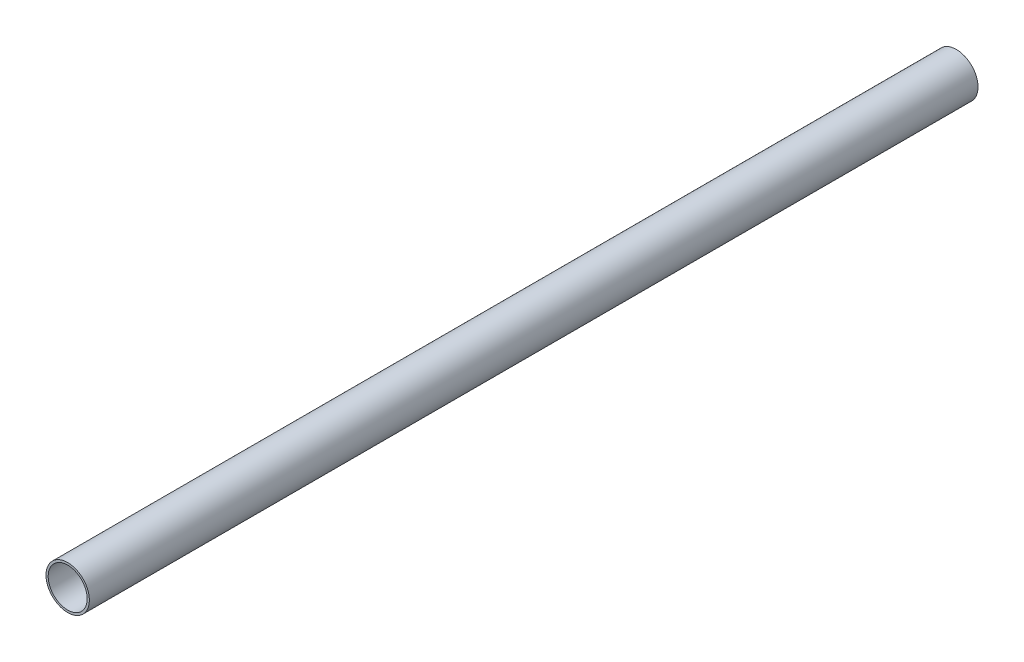
ISO-10303-21;
HEADER;
FILE_DESCRIPTION(('STEP AP214'),'2;1');
FILE_NAME('part.step','',(''),(''),'','','');
FILE_SCHEMA(('AUTOMOTIVE_DESIGN { 1 0 10303 214 1 1 1 1 }'));
ENDSEC;
DATA;
#1=APPLICATION_CONTEXT('core data for automotive mechanical design processes');
#2=APPLICATION_PROTOCOL_DEFINITION('international standard','automotive_design',2000,#1);
#3=PRODUCT_CONTEXT('',#1,'mechanical');
#4=PRODUCT('Part','Part','',(#3));
#5=PRODUCT_RELATED_PRODUCT_CATEGORY('part','',(#4));
#6=PRODUCT_DEFINITION_FORMATION('','',#4);
#7=PRODUCT_DEFINITION_CONTEXT('part definition',#1,'design');
#8=PRODUCT_DEFINITION('design','',#6,#7);
#9=PRODUCT_DEFINITION_SHAPE('','',#8);
#10=(LENGTH_UNIT() NAMED_UNIT(*) SI_UNIT(.MILLI.,.METRE.));
#11=(NAMED_UNIT(*) PLANE_ANGLE_UNIT() SI_UNIT($,.RADIAN.));
#12=(NAMED_UNIT(*) SI_UNIT($,.STERADIAN.) SOLID_ANGLE_UNIT());
#13=UNCERTAINTY_MEASURE_WITH_UNIT(LENGTH_MEASURE(1.E-05),#10,'distance_accuracy_value','');
#14=(GEOMETRIC_REPRESENTATION_CONTEXT(3) GLOBAL_UNCERTAINTY_ASSIGNED_CONTEXT((#13)) GLOBAL_UNIT_ASSIGNED_CONTEXT((#10,
#11,#12)) REPRESENTATION_CONTEXT('',''));
#15=CARTESIAN_POINT('',(0.,0.,0.));
#16=DIRECTION('',(0.,0.,1.));
#17=DIRECTION('',(1.,0.,0.));
#18=AXIS2_PLACEMENT_3D('',#15,#16,#17);
#19=CARTESIAN_POINT('',(0.,0.,410.));
#20=DIRECTION('',(0.,0.,1.));
#21=DIRECTION('',(1.,0.,0.));
#22=AXIS2_PLACEMENT_3D('',#19,#20,#21);
#23=PLANE('',#22);
#24=CARTESIAN_POINT('',(0.,0.,410.));
#25=DIRECTION('',(0.,0.,1.));
#26=DIRECTION('',(1.,0.,0.));
#27=AXIS2_PLACEMENT_3D('',#24,#25,#26);
#28=CIRCLE('',#27,10.);
#29=CARTESIAN_POINT('',(-10.,0.,410.));
#30=VERTEX_POINT('',#29);
#31=EDGE_CURVE('E10',#30,#30,#28,.T.);
#32=ORIENTED_EDGE('',*,*,#31,.T.);
#33=EDGE_LOOP('',(#32));
#34=FACE_BOUND('',#33,.T.);
#35=CARTESIAN_POINT('',(0.,0.,410.));
#36=DIRECTION('',(0.,0.,1.));
#37=DIRECTION('',(1.,0.,0.));
#38=AXIS2_PLACEMENT_3D('',#35,#36,#37);
#39=CIRCLE('',#38,9.);
#40=CARTESIAN_POINT('',(-9.,0.,410.));
#41=VERTEX_POINT('',#40);
#42=EDGE_CURVE('E54',#41,#41,#39,.T.);
#43=ORIENTED_EDGE('',*,*,#42,.F.);
#44=EDGE_LOOP('',(#43));
#45=FACE_BOUND('',#44,.T.);
#46=ADVANCED_FACE('F41',(#34,#45),#23,.T.);
#47=CARTESIAN_POINT('',(0.,0.,0.));
#48=DIRECTION('',(0.,0.,1.));
#49=DIRECTION('',(1.,0.,0.));
#50=AXIS2_PLACEMENT_3D('',#47,#48,#49);
#51=PLANE('',#50);
#52=CARTESIAN_POINT('',(0.,0.,0.));
#53=DIRECTION('',(0.,0.,1.));
#54=DIRECTION('',(1.,0.,0.));
#55=AXIS2_PLACEMENT_3D('',#52,#53,#54);
#56=CIRCLE('',#55,10.);
#57=CARTESIAN_POINT('',(-10.,0.,0.));
#58=VERTEX_POINT('',#57);
#59=EDGE_CURVE('E45',#58,#58,#56,.T.);
#60=ORIENTED_EDGE('',*,*,#59,.F.);
#61=EDGE_LOOP('',(#60));
#62=FACE_BOUND('',#61,.T.);
#63=CARTESIAN_POINT('',(0.,0.,0.));
#64=DIRECTION('',(0.,0.,1.));
#65=DIRECTION('',(1.,0.,0.));
#66=AXIS2_PLACEMENT_3D('',#63,#64,#65);
#67=CIRCLE('',#66,9.);
#68=CARTESIAN_POINT('',(-9.,0.,0.));
#69=VERTEX_POINT('',#68);
#70=EDGE_CURVE('E56',#69,#69,#67,.T.);
#71=ORIENTED_EDGE('',*,*,#70,.T.);
#72=EDGE_LOOP('',(#71));
#73=FACE_BOUND('',#72,.T.);
#74=ADVANCED_FACE('F68',(#62,#73),#51,.F.);
#75=CARTESIAN_POINT('',(0.,0.,410.));
#76=DIRECTION('',(0.,0.,-1.));
#77=DIRECTION('',(-1.,0.,0.));
#78=AXIS2_PLACEMENT_3D('',#75,#76,#77);
#79=CYLINDRICAL_SURFACE('',#78,10.);
#80=CARTESIAN_POINT('',(-10.,0.,410.));
#81=CARTESIAN_POINT('',(-10.,0.,405.729166666667));
#82=CARTESIAN_POINT('',(-10.,0.,401.458333333333));
#83=CARTESIAN_POINT('',(-10.,0.,392.916666666667));
#84=CARTESIAN_POINT('',(-10.,0.,388.645833333333));
#85=CARTESIAN_POINT('',(-10.,0.,380.104166666667));
#86=CARTESIAN_POINT('',(-10.,0.,375.833333333333));
#87=CARTESIAN_POINT('',(-10.,0.,367.291666666667));
#88=CARTESIAN_POINT('',(-10.,0.,363.020833333333));
#89=CARTESIAN_POINT('',(-10.,0.,354.479166666667));
#90=CARTESIAN_POINT('',(-10.,0.,350.208333333333));
#91=CARTESIAN_POINT('',(-10.,0.,341.666666666667));
#92=CARTESIAN_POINT('',(-10.,0.,337.395833333333));
#93=CARTESIAN_POINT('',(-10.,0.,328.854166666667));
#94=CARTESIAN_POINT('',(-10.,0.,324.583333333333));
#95=CARTESIAN_POINT('',(-10.,0.,316.041666666667));
#96=CARTESIAN_POINT('',(-10.,0.,311.770833333333));
#97=CARTESIAN_POINT('',(-10.,0.,303.229166666667));
#98=CARTESIAN_POINT('',(-10.,0.,298.958333333333));
#99=CARTESIAN_POINT('',(-10.,0.,290.416666666667));
#100=CARTESIAN_POINT('',(-10.,0.,286.145833333333));
#101=CARTESIAN_POINT('',(-10.,0.,277.604166666667));
#102=CARTESIAN_POINT('',(-10.,0.,273.333333333333));
#103=CARTESIAN_POINT('',(-10.,0.,264.791666666667));
#104=CARTESIAN_POINT('',(-10.,0.,260.520833333333));
#105=CARTESIAN_POINT('',(-10.,0.,251.979166666667));
#106=CARTESIAN_POINT('',(-10.,0.,247.708333333333));
#107=CARTESIAN_POINT('',(-10.,0.,239.166666666667));
#108=CARTESIAN_POINT('',(-10.,0.,234.895833333333));
#109=CARTESIAN_POINT('',(-10.,0.,226.354166666667));
#110=CARTESIAN_POINT('',(-10.,0.,222.083333333333));
#111=CARTESIAN_POINT('',(-10.,0.,213.541666666667));
#112=CARTESIAN_POINT('',(-10.,0.,209.270833333333));
#113=CARTESIAN_POINT('',(-10.,0.,200.729166666667));
#114=CARTESIAN_POINT('',(-10.,0.,196.458333333333));
#115=CARTESIAN_POINT('',(-10.,0.,187.916666666667));
#116=CARTESIAN_POINT('',(-10.,0.,183.645833333333));
#117=CARTESIAN_POINT('',(-10.,0.,175.104166666667));
#118=CARTESIAN_POINT('',(-10.,0.,170.833333333333));
#119=CARTESIAN_POINT('',(-10.,0.,162.291666666667));
#120=CARTESIAN_POINT('',(-10.,0.,158.020833333333));
#121=CARTESIAN_POINT('',(-10.,0.,149.479166666667));
#122=CARTESIAN_POINT('',(-10.,0.,145.208333333333));
#123=CARTESIAN_POINT('',(-10.,0.,136.666666666667));
#124=CARTESIAN_POINT('',(-10.,0.,132.395833333333));
#125=CARTESIAN_POINT('',(-10.,0.,123.854166666667));
#126=CARTESIAN_POINT('',(-10.,0.,119.583333333333));
#127=CARTESIAN_POINT('',(-10.,0.,111.041666666667));
#128=CARTESIAN_POINT('',(-10.,0.,106.770833333333));
#129=CARTESIAN_POINT('',(-10.,0.,98.2291666666667));
#130=CARTESIAN_POINT('',(-10.,0.,93.9583333333334));
#131=CARTESIAN_POINT('',(-10.,0.,85.4166666666667));
#132=CARTESIAN_POINT('',(-10.,0.,81.1458333333334));
#133=CARTESIAN_POINT('',(-10.,0.,72.6041666666667));
#134=CARTESIAN_POINT('',(-10.,0.,68.3333333333334));
#135=CARTESIAN_POINT('',(-10.,0.,59.7916666666667));
#136=CARTESIAN_POINT('',(-10.,0.,55.5208333333333));
#137=CARTESIAN_POINT('',(-10.,0.,46.9791666666667));
#138=CARTESIAN_POINT('',(-10.,0.,42.7083333333333));
#139=CARTESIAN_POINT('',(-10.,0.,34.1666666666667));
#140=CARTESIAN_POINT('',(-10.,0.,29.8958333333333));
#141=CARTESIAN_POINT('',(-10.,0.,21.3541666666667));
#142=CARTESIAN_POINT('',(-10.,0.,17.0833333333333));
#143=CARTESIAN_POINT('',(-10.,0.,8.54166666666667));
#144=CARTESIAN_POINT('',(-10.,0.,4.27083333333333));
#145=CARTESIAN_POINT('',(-10.,0.,0.));
#146=B_SPLINE_CURVE_WITH_KNOTS('',3,(#80,#81,#82,#83,#84,#85,#86,#87,#88,#89,#90,#91,#92,#93,
#94,#95,#96,#97,#98,#99,#100,#101,#102,#103,#104,#105,#106,#107,#108,#109,#110,#111,#112,#113,
#114,#115,#116,#117,#118,#119,#120,#121,#122,#123,#124,#125,#126,#127,#128,#129,#130,#131,#132,
#133,#134,#135,#136,#137,#138,#139,#140,#141,#142,#143,#144,#145),.UNSPECIFIED.,.F.,.F.,(4,2,2,
2,2,2,2,2,2,2,2,2,2,2,2,2,2,2,2,2,2,2,2,2,2,2,2,2,2,2,2,2,4),(0.,12.8125,25.625,38.4375,51.25,
64.0625,76.875,89.6875,102.5,115.3125,128.125,140.9375,153.75,166.5625,179.375,192.1875,205.,
217.8125,230.625,243.4375,256.25,269.0625,281.875,294.6875,307.5,320.3125,333.125,345.9375,
358.75,371.5625,384.375,397.1875,410.),.UNSPECIFIED.);
#147=EDGE_CURVE('BSEAM43',#30,#58,#146,.T.);
#148=ORIENTED_EDGE('',*,*,#31,.F.);
#149=ORIENTED_EDGE('',*,*,#59,.T.);
#150=ORIENTED_EDGE('',*,*,#147,.T.);
#151=ORIENTED_EDGE('',*,*,#147,.F.);
#152=EDGE_LOOP('',(#148,#150,#149,#151));
#153=FACE_BOUND('',#152,.T.);
#154=ADVANCED_FACE('F43',(#153),#79,.T.);
#155=CARTESIAN_POINT('',(0.,0.,410.));
#156=DIRECTION('',(0.,0.,-1.));
#157=DIRECTION('',(-1.,0.,0.));
#158=AXIS2_PLACEMENT_3D('',#155,#156,#157);
#159=CYLINDRICAL_SURFACE('',#158,9.);
#160=CARTESIAN_POINT('',(-9.,0.,410.));
#161=CARTESIAN_POINT('',(-9.,0.,405.729166666667));
#162=CARTESIAN_POINT('',(-9.,0.,401.458333333333));
#163=CARTESIAN_POINT('',(-9.,0.,392.916666666667));
#164=CARTESIAN_POINT('',(-9.,0.,388.645833333333));
#165=CARTESIAN_POINT('',(-9.,0.,380.104166666667));
#166=CARTESIAN_POINT('',(-9.,0.,375.833333333333));
#167=CARTESIAN_POINT('',(-9.,0.,367.291666666667));
#168=CARTESIAN_POINT('',(-9.,0.,363.020833333333));
#169=CARTESIAN_POINT('',(-9.,0.,354.479166666667));
#170=CARTESIAN_POINT('',(-9.,0.,350.208333333333));
#171=CARTESIAN_POINT('',(-9.,0.,341.666666666667));
#172=CARTESIAN_POINT('',(-9.,0.,337.395833333333));
#173=CARTESIAN_POINT('',(-9.,0.,328.854166666667));
#174=CARTESIAN_POINT('',(-9.,0.,324.583333333333));
#175=CARTESIAN_POINT('',(-9.,0.,316.041666666667));
#176=CARTESIAN_POINT('',(-9.,0.,311.770833333333));
#177=CARTESIAN_POINT('',(-9.,0.,303.229166666667));
#178=CARTESIAN_POINT('',(-9.,0.,298.958333333333));
#179=CARTESIAN_POINT('',(-9.,0.,290.416666666667));
#180=CARTESIAN_POINT('',(-9.,0.,286.145833333333));
#181=CARTESIAN_POINT('',(-9.,0.,277.604166666667));
#182=CARTESIAN_POINT('',(-9.,0.,273.333333333333));
#183=CARTESIAN_POINT('',(-9.,0.,264.791666666667));
#184=CARTESIAN_POINT('',(-9.,0.,260.520833333333));
#185=CARTESIAN_POINT('',(-9.,0.,251.979166666667));
#186=CARTESIAN_POINT('',(-9.,0.,247.708333333333));
#187=CARTESIAN_POINT('',(-9.,0.,239.166666666667));
#188=CARTESIAN_POINT('',(-9.,0.,234.895833333333));
#189=CARTESIAN_POINT('',(-9.,0.,226.354166666667));
#190=CARTESIAN_POINT('',(-9.,0.,222.083333333333));
#191=CARTESIAN_POINT('',(-9.,0.,213.541666666667));
#192=CARTESIAN_POINT('',(-9.,0.,209.270833333333));
#193=CARTESIAN_POINT('',(-9.,0.,200.729166666667));
#194=CARTESIAN_POINT('',(-9.,0.,196.458333333333));
#195=CARTESIAN_POINT('',(-9.,0.,187.916666666667));
#196=CARTESIAN_POINT('',(-9.,0.,183.645833333333));
#197=CARTESIAN_POINT('',(-9.,0.,175.104166666667));
#198=CARTESIAN_POINT('',(-9.,0.,170.833333333333));
#199=CARTESIAN_POINT('',(-9.,0.,162.291666666667));
#200=CARTESIAN_POINT('',(-9.,0.,158.020833333333));
#201=CARTESIAN_POINT('',(-9.,0.,149.479166666667));
#202=CARTESIAN_POINT('',(-9.,0.,145.208333333333));
#203=CARTESIAN_POINT('',(-9.,0.,136.666666666667));
#204=CARTESIAN_POINT('',(-9.,0.,132.395833333333));
#205=CARTESIAN_POINT('',(-9.,0.,123.854166666667));
#206=CARTESIAN_POINT('',(-9.,0.,119.583333333333));
#207=CARTESIAN_POINT('',(-9.,0.,111.041666666667));
#208=CARTESIAN_POINT('',(-9.,0.,106.770833333333));
#209=CARTESIAN_POINT('',(-9.,0.,98.2291666666666));
#210=CARTESIAN_POINT('',(-9.,0.,93.9583333333333));
#211=CARTESIAN_POINT('',(-9.,0.,85.4166666666666));
#212=CARTESIAN_POINT('',(-9.,0.,81.1458333333333));
#213=CARTESIAN_POINT('',(-9.,0.,72.6041666666667));
#214=CARTESIAN_POINT('',(-9.,0.,68.3333333333333));
#215=CARTESIAN_POINT('',(-9.,0.,59.7916666666667));
#216=CARTESIAN_POINT('',(-9.,0.,55.5208333333333));
#217=CARTESIAN_POINT('',(-9.,0.,46.9791666666667));
#218=CARTESIAN_POINT('',(-9.,0.,42.7083333333333));
#219=CARTESIAN_POINT('',(-9.,0.,34.1666666666667));
#220=CARTESIAN_POINT('',(-9.,0.,29.8958333333333));
#221=CARTESIAN_POINT('',(-9.,0.,21.3541666666667));
#222=CARTESIAN_POINT('',(-9.,0.,17.0833333333333));
#223=CARTESIAN_POINT('',(-9.,0.,8.54166666666667));
#224=CARTESIAN_POINT('',(-9.,0.,4.27083333333333));
#225=CARTESIAN_POINT('',(-9.,0.,0.));
#226=B_SPLINE_CURVE_WITH_KNOTS('',3,(#160,#161,#162,#163,#164,#165,#166,#167,#168,#169,#170,
#171,#172,#173,#174,#175,#176,#177,#178,#179,#180,#181,#182,#183,#184,#185,#186,#187,#188,#189,
#190,#191,#192,#193,#194,#195,#196,#197,#198,#199,#200,#201,#202,#203,#204,#205,#206,#207,#208,
#209,#210,#211,#212,#213,#214,#215,#216,#217,#218,#219,#220,#221,#222,#223,#224,#225),
.UNSPECIFIED.,.F.,.F.,(4,2,2,2,2,2,2,2,2,2,2,2,2,2,2,2,2,2,2,2,2,2,2,2,2,2,2,2,2,2,2,2,4),(0.,
12.8124999999999,25.625,38.4375,51.25,64.0625,76.875,89.6874999999999,102.5,115.3125,128.125,
140.9375,153.75,166.5625,179.375,192.1875,205.,217.8125,230.625,243.4375,256.25,269.0625,
281.875,294.6875,307.5,320.3125,333.125,345.9375,358.75,371.5625,384.375,397.1875,410.),.UNSPECIFIED.);
#227=EDGE_CURVE('BSEAM64',#41,#69,#226,.T.);
#228=ORIENTED_EDGE('',*,*,#42,.T.);
#229=ORIENTED_EDGE('',*,*,#70,.F.);
#230=ORIENTED_EDGE('',*,*,#227,.T.);
#231=ORIENTED_EDGE('',*,*,#227,.F.);
#232=EDGE_LOOP('',(#228,#230,#229,#231));
#233=FACE_BOUND('',#232,.T.);
#234=ADVANCED_FACE('F64',(#233),#159,.F.);
#235=CLOSED_SHELL('',(#46,#74,#154,#234));
#236=MANIFOLD_SOLID_BREP('B2',#235);
#237=ADVANCED_BREP_SHAPE_REPRESENTATION('',(#18,#236),#14);
#238=SHAPE_DEFINITION_REPRESENTATION(#9,#237);
ENDSEC;
END-ISO-10303-21;
